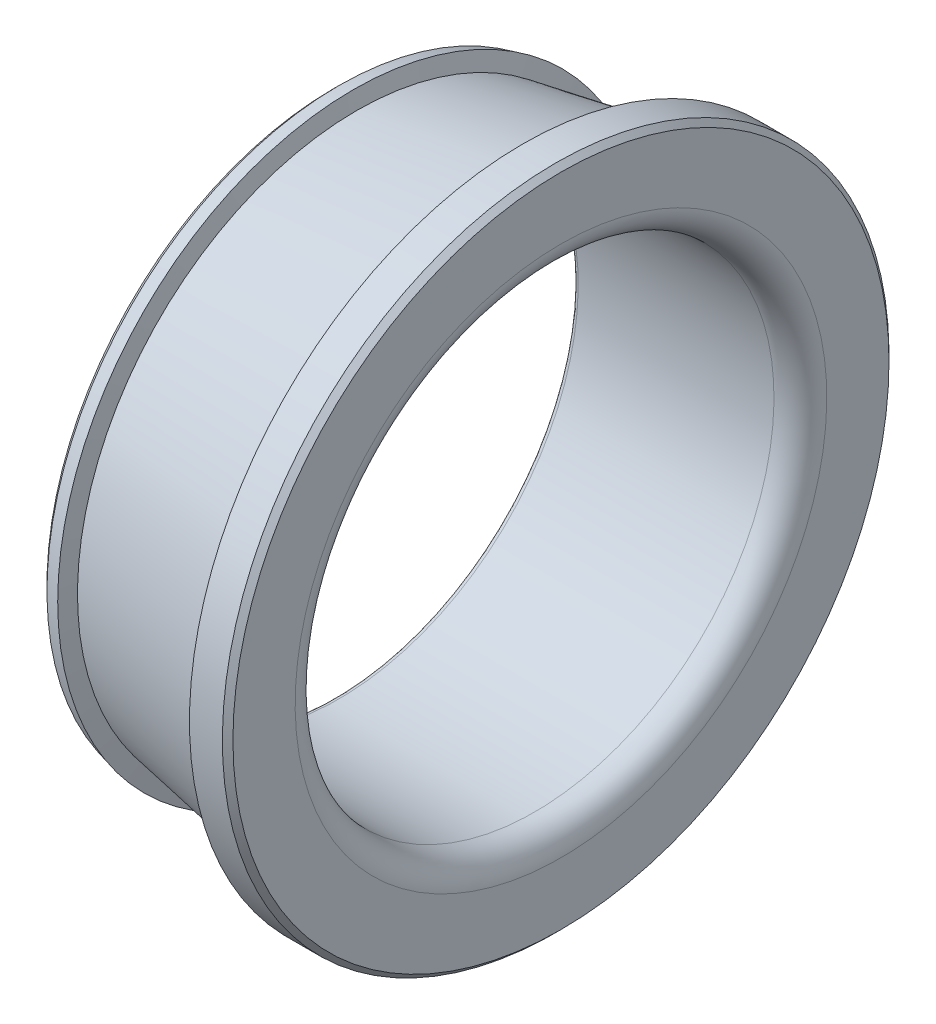
ISO-10303-21;
HEADER;
FILE_DESCRIPTION(('STEP AP214'),'2;1');
FILE_NAME('part.step','',(''),(''),'','','');
FILE_SCHEMA(('AUTOMOTIVE_DESIGN { 1 0 10303 214 1 1 1 1 }'));
ENDSEC;
DATA;
#1=APPLICATION_CONTEXT('core data for automotive mechanical design processes');
#2=APPLICATION_PROTOCOL_DEFINITION('international standard','automotive_design',2000,#1);
#3=PRODUCT_CONTEXT('',#1,'mechanical');
#4=PRODUCT('Part','Part','',(#3));
#5=PRODUCT_RELATED_PRODUCT_CATEGORY('part','',(#4));
#6=PRODUCT_DEFINITION_FORMATION('','',#4);
#7=PRODUCT_DEFINITION_CONTEXT('part definition',#1,'design');
#8=PRODUCT_DEFINITION('design','',#6,#7);
#9=PRODUCT_DEFINITION_SHAPE('','',#8);
#10=(LENGTH_UNIT() NAMED_UNIT(*) SI_UNIT(.MILLI.,.METRE.));
#11=(NAMED_UNIT(*) PLANE_ANGLE_UNIT() SI_UNIT($,.RADIAN.));
#12=(NAMED_UNIT(*) SI_UNIT($,.STERADIAN.) SOLID_ANGLE_UNIT());
#13=UNCERTAINTY_MEASURE_WITH_UNIT(LENGTH_MEASURE(1.E-05),#10,'distance_accuracy_value','');
#14=(GEOMETRIC_REPRESENTATION_CONTEXT(3) GLOBAL_UNCERTAINTY_ASSIGNED_CONTEXT((#13)) GLOBAL_UNIT_ASSIGNED_CONTEXT((#10,
#11,#12)) REPRESENTATION_CONTEXT('',''));
#15=CARTESIAN_POINT('',(0.,0.,0.));
#16=DIRECTION('',(0.,0.,1.));
#17=DIRECTION('',(1.,0.,0.));
#18=AXIS2_PLACEMENT_3D('',#15,#16,#17);
#19=CARTESIAN_POINT('',(11.0654,0.,0.));
#20=DIRECTION('',(1.,0.,0.));
#21=DIRECTION('',(0.,1.,0.));
#22=AXIS2_PLACEMENT_3D('',#19,#20,#21);
#23=CONICAL_SURFACE('',#22,41.45,0.259331376520049);
#24=CARTESIAN_POINT('',(0.7,0.,0.));
#25=DIRECTION('',(1.,0.,0.));
#26=DIRECTION('',(0.,1.,0.));
#27=AXIS2_PLACEMENT_3D('',#24,#25,#26);
#28=CIRCLE('',#27,38.7);
#29=CARTESIAN_POINT('',(0.7,38.7,0.));
#30=VERTEX_POINT('',#29);
#31=EDGE_CURVE('E11',#30,#30,#28,.T.);
#32=ORIENTED_EDGE('',*,*,#31,.T.);
#33=EDGE_LOOP('',(#32));
#34=FACE_BOUND('',#33,.T.);
#35=CARTESIAN_POINT('',(2.64005358972706,0.,0.));
#36=DIRECTION('',(-1.,0.,0.));
#37=DIRECTION('',(0.,1.,0.));
#38=AXIS2_PLACEMENT_3D('',#35,#36,#37);
#39=CIRCLE('',#38,39.2147073312896);
#40=CARTESIAN_POINT('',(2.64005358972706,-39.2147073312896,0.));
#41=VERTEX_POINT('',#40);
#42=EDGE_CURVE('E74',#41,#41,#39,.T.);
#43=ORIENTED_EDGE('',*,*,#42,.T.);
#44=EDGE_LOOP('',(#43));
#45=FACE_BOUND('',#44,.T.);
#46=ADVANCED_FACE('F17',(#34,#45),#23,.T.);
#47=CARTESIAN_POINT('',(0.35,0.,0.));
#48=DIRECTION('',(1.,0.,0.));
#49=DIRECTION('',(0.,1.,0.));
#50=AXIS2_PLACEMENT_3D('',#47,#48,#49);
#51=CONICAL_SURFACE('',#50,38.35,0.78539816339745);
#52=CARTESIAN_POINT('',(0.,0.,0.));
#53=DIRECTION('',(1.,0.,0.));
#54=DIRECTION('',(0.,1.,0.));
#55=AXIS2_PLACEMENT_3D('',#52,#53,#54);
#56=CIRCLE('',#55,38.);
#57=CARTESIAN_POINT('',(0.,38.,0.));
#58=VERTEX_POINT('',#57);
#59=EDGE_CURVE('E27',#58,#58,#56,.T.);
#60=ORIENTED_EDGE('',*,*,#59,.T.);
#61=EDGE_LOOP('',(#60));
#62=FACE_BOUND('',#61,.T.);
#63=ORIENTED_EDGE('',*,*,#31,.F.);
#64=EDGE_LOOP('',(#63));
#65=FACE_BOUND('',#64,.T.);
#66=ADVANCED_FACE('F103',(#62,#65),#51,.T.);
#67=CARTESIAN_POINT('',(0.,35.225,0.));
#68=DIRECTION('',(-1.,0.,0.));
#69=DIRECTION('',(0.,-1.,0.));
#70=AXIS2_PLACEMENT_3D('',#67,#68,#69);
#71=PLANE('',#70);
#72=CARTESIAN_POINT('',(0.,0.,0.));
#73=DIRECTION('',(1.,0.,0.));
#74=DIRECTION('',(0.,1.,0.));
#75=AXIS2_PLACEMENT_3D('',#72,#73,#74);
#76=CIRCLE('',#75,32.45);
#77=CARTESIAN_POINT('',(0.,32.45,0.));
#78=VERTEX_POINT('',#77);
#79=EDGE_CURVE('E76',#78,#78,#76,.T.);
#80=ORIENTED_EDGE('',*,*,#79,.T.);
#81=EDGE_LOOP('',(#80));
#82=FACE_BOUND('',#81,.T.);
#83=ORIENTED_EDGE('',*,*,#59,.F.);
#84=EDGE_LOOP('',(#83));
#85=FACE_BOUND('',#84,.T.);
#86=ADVANCED_FACE('F109',(#82,#85),#71,.T.);
#87=CARTESIAN_POINT('',(0.7,0.,0.));
#88=DIRECTION('',(1.,0.,0.));
#89=DIRECTION('',(0.,0.,-1.));
#90=AXIS2_PLACEMENT_3D('',#87,#88,#89);
#91=TOROIDAL_SURFACE('',#90,32.45,0.7);
#92=CARTESIAN_POINT('',(0.7,0.,0.));
#93=DIRECTION('',(1.,0.,0.));
#94=DIRECTION('',(0.,1.,0.));
#95=AXIS2_PLACEMENT_3D('',#92,#93,#94);
#96=CIRCLE('',#95,31.75);
#97=CARTESIAN_POINT('',(0.7,31.75,0.));
#98=VERTEX_POINT('',#97);
#99=EDGE_CURVE('E81',#98,#98,#96,.T.);
#100=ORIENTED_EDGE('',*,*,#99,.T.);
#101=EDGE_LOOP('',(#100));
#102=FACE_BOUND('',#101,.T.);
#103=ORIENTED_EDGE('',*,*,#79,.F.);
#104=EDGE_LOOP('',(#103));
#105=FACE_BOUND('',#104,.T.);
#106=ADVANCED_FACE('F118',(#102,#105),#91,.T.);
#107=CARTESIAN_POINT('',(13.681,0.,0.));
#108=DIRECTION('',(-1.,0.,0.));
#109=DIRECTION('',(0.,1.,0.));
#110=AXIS2_PLACEMENT_3D('',#107,#108,#109);
#111=CYLINDRICAL_SURFACE('',#110,31.75);
#112=CARTESIAN_POINT('',(26.662,0.,0.));
#113=DIRECTION('',(1.,0.,0.));
#114=DIRECTION('',(0.,1.,0.));
#115=AXIS2_PLACEMENT_3D('',#112,#113,#114);
#116=CIRCLE('',#115,31.75);
#117=CARTESIAN_POINT('',(26.662,31.75,0.));
#118=VERTEX_POINT('',#117);
#119=EDGE_CURVE('E78',#118,#118,#116,.T.);
#120=ORIENTED_EDGE('',*,*,#119,.T.);
#121=EDGE_LOOP('',(#120));
#122=FACE_BOUND('',#121,.T.);
#123=ORIENTED_EDGE('',*,*,#99,.F.);
#124=EDGE_LOOP('',(#123));
#125=FACE_BOUND('',#124,.T.);
#126=ADVANCED_FACE('F19',(#122,#125),#111,.F.);
#127=CARTESIAN_POINT('',(26.662,0.,0.));
#128=DIRECTION('',(1.,0.,0.));
#129=DIRECTION('',(0.,0.,-1.));
#130=AXIS2_PLACEMENT_3D('',#127,#128,#129);
#131=TOROIDAL_SURFACE('',#130,35.25,3.5);
#132=CARTESIAN_POINT('',(30.162,0.,0.));
#133=DIRECTION('',(1.,0.,0.));
#134=DIRECTION('',(0.,1.,0.));
#135=AXIS2_PLACEMENT_3D('',#132,#133,#134);
#136=CIRCLE('',#135,35.25);
#137=CARTESIAN_POINT('',(30.162,35.25,0.));
#138=VERTEX_POINT('',#137);
#139=EDGE_CURVE('E72',#138,#138,#136,.T.);
#140=ORIENTED_EDGE('',*,*,#139,.T.);
#141=EDGE_LOOP('',(#140));
#142=FACE_BOUND('',#141,.T.);
#143=ORIENTED_EDGE('',*,*,#119,.F.);
#144=EDGE_LOOP('',(#143));
#145=FACE_BOUND('',#144,.T.);
#146=ADVANCED_FACE('F113',(#142,#145),#131,.T.);
#147=CARTESIAN_POINT('',(30.162,39.375,0.));
#148=DIRECTION('',(1.,0.,0.));
#149=DIRECTION('',(0.,1.,0.));
#150=AXIS2_PLACEMENT_3D('',#147,#148,#149);
#151=PLANE('',#150);
#152=CARTESIAN_POINT('',(30.162,0.,0.));
#153=DIRECTION('',(1.,0.,0.));
#154=DIRECTION('',(0.,1.,0.));
#155=AXIS2_PLACEMENT_3D('',#152,#153,#154);
#156=CIRCLE('',#155,43.5);
#157=CARTESIAN_POINT('',(30.162,43.5,0.));
#158=VERTEX_POINT('',#157);
#159=EDGE_CURVE('E62',#158,#158,#156,.T.);
#160=ORIENTED_EDGE('',*,*,#159,.T.);
#161=EDGE_LOOP('',(#160));
#162=FACE_BOUND('',#161,.T.);
#163=ORIENTED_EDGE('',*,*,#139,.F.);
#164=EDGE_LOOP('',(#163));
#165=FACE_BOUND('',#164,.T.);
#166=ADVANCED_FACE('F129',(#162,#165),#151,.T.);
#167=CARTESIAN_POINT('',(29.812,0.,0.));
#168=DIRECTION('',(-1.,0.,0.));
#169=DIRECTION('',(0.,1.,0.));
#170=AXIS2_PLACEMENT_3D('',#167,#168,#169);
#171=CONICAL_SURFACE('',#170,43.85,0.78539816339745);
#172=CARTESIAN_POINT('',(29.462,0.,0.));
#173=DIRECTION('',(1.,0.,0.));
#174=DIRECTION('',(0.,1.,0.));
#175=AXIS2_PLACEMENT_3D('',#172,#173,#174);
#176=CIRCLE('',#175,44.2);
#177=CARTESIAN_POINT('',(29.462,44.2,0.));
#178=VERTEX_POINT('',#177);
#179=EDGE_CURVE('E67',#178,#178,#176,.T.);
#180=ORIENTED_EDGE('',*,*,#179,.T.);
#181=EDGE_LOOP('',(#180));
#182=FACE_BOUND('',#181,.T.);
#183=ORIENTED_EDGE('',*,*,#159,.F.);
#184=EDGE_LOOP('',(#183));
#185=FACE_BOUND('',#184,.T.);
#186=ADVANCED_FACE('F68',(#182,#185),#171,.T.);
#187=CARTESIAN_POINT('',(25.4464,0.,0.));
#188=DIRECTION('',(-1.,0.,0.));
#189=DIRECTION('',(0.,1.,0.));
#190=AXIS2_PLACEMENT_3D('',#187,#188,#189);
#191=CYLINDRICAL_SURFACE('',#190,44.2);
#192=ORIENTED_EDGE('',*,*,#179,.F.);
#193=EDGE_LOOP('',(#192));
#194=FACE_BOUND('',#193,.T.);
#195=CARTESIAN_POINT('',(25.0971593252434,0.,0.));
#196=DIRECTION('',(1.,0.,0.));
#197=DIRECTION('',(0.,1.,0.));
#198=AXIS2_PLACEMENT_3D('',#195,#196,#197);
#199=CIRCLE('',#198,44.2);
#200=CARTESIAN_POINT('',(25.0971593252434,-44.2,0.));
#201=VERTEX_POINT('',#200);
#202=EDGE_CURVE('E21',#201,#201,#199,.T.);
#203=ORIENTED_EDGE('',*,*,#202,.T.);
#204=EDGE_LOOP('',(#203));
#205=FACE_BOUND('',#204,.T.);
#206=ADVANCED_FACE('F120',(#194,#205),#191,.T.);
#207=CARTESIAN_POINT('',(24.5023116130935,0.,0.));
#208=DIRECTION('',(-1.,0.,0.));
#209=DIRECTION('',(0.,1.,0.));
#210=AXIS2_PLACEMENT_3D('',#207,#208,#209);
#211=CONICAL_SURFACE('',#210,47.1303139403533,1.37051979512855);
#212=CARTESIAN_POINT('',(25.7244021379273,0.,0.));
#213=DIRECTION('',(1.,0.,0.));
#214=DIRECTION('',(0.,1.,0.));
#215=AXIS2_PLACEMENT_3D('',#212,#213,#214);
#216=CIRCLE('',#215,41.1101026692174);
#217=CARTESIAN_POINT('',(25.7244021379273,41.1101026692174,0.));
#218=VERTEX_POINT('',#217);
#219=EDGE_CURVE('E88',#218,#218,#216,.T.);
#220=ORIENTED_EDGE('',*,*,#219,.T.);
#221=EDGE_LOOP('',(#220));
#222=FACE_BOUND('',#221,.T.);
#223=ORIENTED_EDGE('',*,*,#202,.F.);
#224=EDGE_LOOP('',(#223));
#225=FACE_BOUND('',#224,.T.);
#226=ADVANCED_FACE('F98',(#222,#225),#211,.F.);
#227=CARTESIAN_POINT('',(1.9620447669068,0.,0.));
#228=DIRECTION('',(-1.,0.,0.));
#229=DIRECTION('',(0.,1.,0.));
#230=AXIS2_PLACEMENT_3D('',#227,#228,#229);
#231=CONICAL_SURFACE('',#230,42.5546860596468,1.37051979512855);
#232=CARTESIAN_POINT('',(3.08229727221034,0.,0.));
#233=DIRECTION('',(1.,0.,0.));
#234=DIRECTION('',(0.,1.,0.));
#235=AXIS2_PLACEMENT_3D('',#232,#233,#234);
#236=CIRCLE('',#235,37.0361449844158);
#237=CARTESIAN_POINT('',(3.08229727221034,37.0361449844158,0.));
#238=VERTEX_POINT('',#237);
#239=EDGE_CURVE('E90',#238,#238,#236,.T.);
#240=ORIENTED_EDGE('',*,*,#239,.F.);
#241=EDGE_LOOP('',(#240));
#242=FACE_BOUND('',#241,.T.);
#243=ORIENTED_EDGE('',*,*,#42,.F.);
#244=EDGE_LOOP('',(#243));
#245=FACE_BOUND('',#244,.T.);
#246=ADVANCED_FACE('F95',(#242,#245),#231,.T.);
#247=CARTESIAN_POINT('',(14.4033497050688,0.,0.));
#248=DIRECTION('',(1.,0.,0.));
#249=DIRECTION('',(0.,1.,0.));
#250=AXIS2_PLACEMENT_3D('',#247,#248,#249);
#251=CONICAL_SURFACE('',#250,39.0731238268166,0.178023583703422);
#252=ORIENTED_EDGE('',*,*,#219,.F.);
#253=EDGE_LOOP('',(#252));
#254=FACE_BOUND('',#253,.T.);
#255=ORIENTED_EDGE('',*,*,#239,.T.);
#256=EDGE_LOOP('',(#255));
#257=FACE_BOUND('',#256,.T.);
#258=ADVANCED_FACE('F93',(#254,#257),#251,.T.);
#259=CLOSED_SHELL('',(#46,#66,#86,#106,#126,#146,#166,#186,#206,#226,#246,#258));
#260=MANIFOLD_SOLID_BREP('B1',#259);
#261=ADVANCED_BREP_SHAPE_REPRESENTATION('',(#18,#260),#14);
#262=SHAPE_DEFINITION_REPRESENTATION(#9,#261);
ENDSEC;
END-ISO-10303-21;
